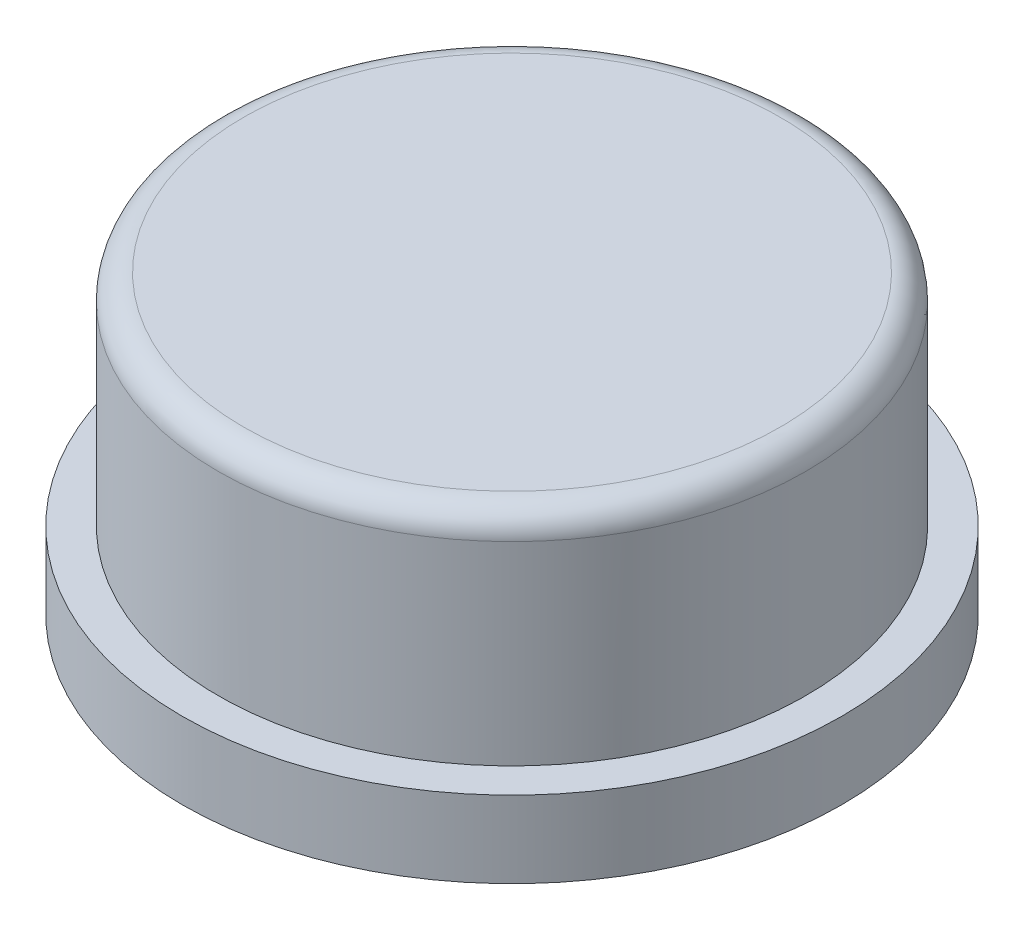
ISO-10303-21;
HEADER;
FILE_DESCRIPTION(('STEP AP214'),'2;1');
FILE_NAME('part.step','',(''),(''),'','','');
FILE_SCHEMA(('AUTOMOTIVE_DESIGN { 1 0 10303 214 1 1 1 1 }'));
ENDSEC;
DATA;
#1=APPLICATION_CONTEXT('core data for automotive mechanical design processes');
#2=APPLICATION_PROTOCOL_DEFINITION('international standard','automotive_design',2000,#1);
#3=PRODUCT_CONTEXT('',#1,'mechanical');
#4=PRODUCT('Part','Part','',(#3));
#5=PRODUCT_RELATED_PRODUCT_CATEGORY('part','',(#4));
#6=PRODUCT_DEFINITION_FORMATION('','',#4);
#7=PRODUCT_DEFINITION_CONTEXT('part definition',#1,'design');
#8=PRODUCT_DEFINITION('design','',#6,#7);
#9=PRODUCT_DEFINITION_SHAPE('','',#8);
#10=(LENGTH_UNIT() NAMED_UNIT(*) SI_UNIT(.MILLI.,.METRE.));
#11=(NAMED_UNIT(*) PLANE_ANGLE_UNIT() SI_UNIT($,.RADIAN.));
#12=(NAMED_UNIT(*) SI_UNIT($,.STERADIAN.) SOLID_ANGLE_UNIT());
#13=UNCERTAINTY_MEASURE_WITH_UNIT(LENGTH_MEASURE(1.E-05),#10,'distance_accuracy_value','');
#14=(GEOMETRIC_REPRESENTATION_CONTEXT(3) GLOBAL_UNCERTAINTY_ASSIGNED_CONTEXT((#13)) GLOBAL_UNIT_ASSIGNED_CONTEXT((#10,
#11,#12)) REPRESENTATION_CONTEXT('',''));
#15=CARTESIAN_POINT('',(0.,0.,0.));
#16=DIRECTION('',(0.,0.,1.));
#17=DIRECTION('',(1.,0.,0.));
#18=AXIS2_PLACEMENT_3D('',#15,#16,#17);
#19=CARTESIAN_POINT('',(0.,1.5,0.));
#20=DIRECTION('',(0.,1.,0.));
#21=DIRECTION('',(0.,0.,1.));
#22=AXIS2_PLACEMENT_3D('',#19,#20,#21);
#23=PLANE('',#22);
#24=CARTESIAN_POINT('',(0.,1.5,0.));
#25=DIRECTION('',(0.,1.,0.));
#26=DIRECTION('',(0.,0.,1.));
#27=AXIS2_PLACEMENT_3D('',#24,#25,#26);
#28=CIRCLE('',#27,6.45);
#29=CARTESIAN_POINT('',(0.,1.5,6.45));
#30=VERTEX_POINT('',#29);
#31=EDGE_CURVE('E42',#30,#30,#28,.T.);
#32=ORIENTED_EDGE('',*,*,#31,.T.);
#33=EDGE_LOOP('',(#32));
#34=FACE_BOUND('',#33,.T.);
#35=CARTESIAN_POINT('',(0.,1.5,0.));
#36=DIRECTION('',(0.,1.,0.));
#37=DIRECTION('',(0.,0.,1.));
#38=AXIS2_PLACEMENT_3D('',#35,#36,#37);
#39=CIRCLE('',#38,5.75);
#40=CARTESIAN_POINT('',(0.,1.5,-5.75));
#41=VERTEX_POINT('',#40);
#42=EDGE_CURVE('E50',#41,#41,#39,.T.);
#43=ORIENTED_EDGE('',*,*,#42,.F.);
#44=EDGE_LOOP('',(#43));
#45=FACE_BOUND('',#44,.T.);
#46=ADVANCED_FACE('F31',(#34,#45),#23,.T.);
#47=CARTESIAN_POINT('',(0.,1.5,0.));
#48=DIRECTION('',(0.,-1.,0.));
#49=DIRECTION('',(0.,0.,-1.));
#50=AXIS2_PLACEMENT_3D('',#47,#48,#49);
#51=CYLINDRICAL_SURFACE('',#50,6.45);
#52=ORIENTED_EDGE('',*,*,#31,.F.);
#53=EDGE_LOOP('',(#52));
#54=FACE_BOUND('',#53,.T.);
#55=CARTESIAN_POINT('',(0.,0.,0.));
#56=DIRECTION('',(0.,1.,0.));
#57=DIRECTION('',(0.,0.,1.));
#58=AXIS2_PLACEMENT_3D('',#55,#56,#57);
#59=CIRCLE('',#58,6.45);
#60=CARTESIAN_POINT('',(0.,0.,6.45));
#61=VERTEX_POINT('',#60);
#62=EDGE_CURVE('E46',#61,#61,#59,.T.);
#63=ORIENTED_EDGE('',*,*,#62,.T.);
#64=EDGE_LOOP('',(#63));
#65=FACE_BOUND('',#64,.T.);
#66=ADVANCED_FACE('F58',(#54,#65),#51,.T.);
#67=CARTESIAN_POINT('',(0.,0.,0.));
#68=DIRECTION('',(0.,1.,0.));
#69=DIRECTION('',(0.,0.,1.));
#70=AXIS2_PLACEMENT_3D('',#67,#68,#69);
#71=PLANE('',#70);
#72=ORIENTED_EDGE('',*,*,#62,.F.);
#73=EDGE_LOOP('',(#72));
#74=FACE_BOUND('',#73,.T.);
#75=ADVANCED_FACE('F64',(#74),#71,.F.);
#76=CARTESIAN_POINT('',(0.,5.8,0.));
#77=DIRECTION('',(0.,-1.,0.));
#78=DIRECTION('',(0.,0.,-1.));
#79=AXIS2_PLACEMENT_3D('',#76,#77,#78);
#80=CYLINDRICAL_SURFACE('',#79,5.75);
#81=CARTESIAN_POINT('',(0.,5.3,0.));
#82=DIRECTION('',(0.,1.,0.));
#83=DIRECTION('',(0.,0.,1.));
#84=AXIS2_PLACEMENT_3D('',#81,#82,#83);
#85=CIRCLE('',#84,5.75);
#86=CARTESIAN_POINT('',(0.,5.3,-5.75));
#87=VERTEX_POINT('',#86);
#88=EDGE_CURVE('E10',#87,#87,#85,.F.);
#89=CARTESIAN_POINT('',(0.,5.3,-5.75));
#90=CARTESIAN_POINT('',(0.,5.26041666666667,-5.75));
#91=CARTESIAN_POINT('',(0.,5.22083333333333,-5.75));
#92=CARTESIAN_POINT('',(0.,5.14166666666666,-5.75));
#93=CARTESIAN_POINT('',(0.,5.10208333333333,-5.75));
#94=CARTESIAN_POINT('',(0.,5.02291666666667,-5.75));
#95=CARTESIAN_POINT('',(0.,4.98333333333333,-5.75));
#96=CARTESIAN_POINT('',(0.,4.90416666666667,-5.75));
#97=CARTESIAN_POINT('',(0.,4.86458333333333,-5.75));
#98=CARTESIAN_POINT('',(0.,4.78541666666667,-5.75));
#99=CARTESIAN_POINT('',(0.,4.74583333333333,-5.75));
#100=CARTESIAN_POINT('',(0.,4.66666666666667,-5.75));
#101=CARTESIAN_POINT('',(0.,4.62708333333333,-5.75));
#102=CARTESIAN_POINT('',(0.,4.54791666666667,-5.75));
#103=CARTESIAN_POINT('',(0.,4.50833333333333,-5.75));
#104=CARTESIAN_POINT('',(0.,4.42916666666667,-5.75));
#105=CARTESIAN_POINT('',(0.,4.38958333333333,-5.75));
#106=CARTESIAN_POINT('',(0.,4.31041666666667,-5.75));
#107=CARTESIAN_POINT('',(0.,4.27083333333333,-5.75));
#108=CARTESIAN_POINT('',(0.,4.19166666666667,-5.75));
#109=CARTESIAN_POINT('',(0.,4.15208333333333,-5.75));
#110=CARTESIAN_POINT('',(0.,4.07291666666667,-5.75));
#111=CARTESIAN_POINT('',(0.,4.03333333333333,-5.75));
#112=CARTESIAN_POINT('',(0.,3.95416666666667,-5.75));
#113=CARTESIAN_POINT('',(0.,3.91458333333333,-5.75));
#114=CARTESIAN_POINT('',(0.,3.83541666666667,-5.75));
#115=CARTESIAN_POINT('',(0.,3.79583333333333,-5.75));
#116=CARTESIAN_POINT('',(0.,3.71666666666667,-5.75));
#117=CARTESIAN_POINT('',(0.,3.67708333333333,-5.75));
#118=CARTESIAN_POINT('',(0.,3.59791666666667,-5.75));
#119=CARTESIAN_POINT('',(0.,3.55833333333333,-5.75));
#120=CARTESIAN_POINT('',(0.,3.47916666666667,-5.75));
#121=CARTESIAN_POINT('',(0.,3.43958333333333,-5.75));
#122=CARTESIAN_POINT('',(0.,3.36041666666667,-5.75));
#123=CARTESIAN_POINT('',(0.,3.32083333333333,-5.75));
#124=CARTESIAN_POINT('',(0.,3.24166666666667,-5.75));
#125=CARTESIAN_POINT('',(0.,3.20208333333333,-5.75));
#126=CARTESIAN_POINT('',(0.,3.12291666666667,-5.75));
#127=CARTESIAN_POINT('',(0.,3.08333333333333,-5.75));
#128=CARTESIAN_POINT('',(0.,3.00416666666667,-5.75));
#129=CARTESIAN_POINT('',(0.,2.96458333333333,-5.75));
#130=CARTESIAN_POINT('',(0.,2.88541666666667,-5.75));
#131=CARTESIAN_POINT('',(0.,2.84583333333333,-5.75));
#132=CARTESIAN_POINT('',(0.,2.76666666666667,-5.75));
#133=CARTESIAN_POINT('',(0.,2.72708333333333,-5.75));
#134=CARTESIAN_POINT('',(0.,2.64791666666667,-5.75));
#135=CARTESIAN_POINT('',(0.,2.60833333333333,-5.75));
#136=CARTESIAN_POINT('',(0.,2.52916666666667,-5.75));
#137=CARTESIAN_POINT('',(0.,2.48958333333333,-5.75));
#138=CARTESIAN_POINT('',(0.,2.41041666666667,-5.75));
#139=CARTESIAN_POINT('',(0.,2.37083333333333,-5.75));
#140=CARTESIAN_POINT('',(0.,2.29166666666667,-5.75));
#141=CARTESIAN_POINT('',(0.,2.25208333333333,-5.75));
#142=CARTESIAN_POINT('',(0.,2.17291666666667,-5.75));
#143=CARTESIAN_POINT('',(0.,2.13333333333333,-5.75));
#144=CARTESIAN_POINT('',(0.,2.05416666666667,-5.75));
#145=CARTESIAN_POINT('',(0.,2.01458333333333,-5.75));
#146=CARTESIAN_POINT('',(0.,1.93541666666667,-5.75));
#147=CARTESIAN_POINT('',(0.,1.89583333333333,-5.75));
#148=CARTESIAN_POINT('',(0.,1.81666666666667,-5.75));
#149=CARTESIAN_POINT('',(0.,1.77708333333333,-5.75));
#150=CARTESIAN_POINT('',(0.,1.69791666666667,-5.75));
#151=CARTESIAN_POINT('',(0.,1.65833333333333,-5.75));
#152=CARTESIAN_POINT('',(0.,1.57916666666667,-5.75));
#153=CARTESIAN_POINT('',(0.,1.53958333333333,-5.75));
#154=CARTESIAN_POINT('',(0.,1.5,-5.75));
#155=B_SPLINE_CURVE_WITH_KNOTS('',3,(#89,#90,#91,#92,#93,#94,#95,#96,#97,#98,#99,#100,#101,#102,
#103,#104,#105,#106,#107,#108,#109,#110,#111,#112,#113,#114,#115,#116,#117,#118,#119,#120,#121,
#122,#123,#124,#125,#126,#127,#128,#129,#130,#131,#132,#133,#134,#135,#136,#137,#138,#139,#140,
#141,#142,#143,#144,#145,#146,#147,#148,#149,#150,#151,#152,#153,#154),.UNSPECIFIED.,.F.,.F.,(4,
2,2,2,2,2,2,2,2,2,2,2,2,2,2,2,2,2,2,2,2,2,2,2,2,2,2,2,2,2,2,2,4),(0.,0.11875,0.2375,0.35625,
0.475,0.59375,0.7125,0.831249999999999,0.95,1.06875,1.1875,1.30625,1.425,1.54375,1.6625,1.78125,
1.9,2.01875,2.1375,2.25625,2.375,2.49375,2.6125,2.73125,2.85,2.96875,3.0875,3.20625,3.325,
3.44375,3.5625,3.68125,3.8),.UNSPECIFIED.);
#156=EDGE_CURVE('BSEAM55',#87,#41,#155,.T.);
#157=ORIENTED_EDGE('',*,*,#88,.T.);
#158=ORIENTED_EDGE('',*,*,#42,.T.);
#159=ORIENTED_EDGE('',*,*,#156,.T.);
#160=ORIENTED_EDGE('',*,*,#156,.F.);
#161=EDGE_LOOP('',(#157,#159,#158,#160));
#162=FACE_BOUND('',#161,.T.);
#163=ADVANCED_FACE('F55',(#162),#80,.T.);
#164=CARTESIAN_POINT('',(0.,5.8,0.));
#165=DIRECTION('',(0.,1.,0.));
#166=DIRECTION('',(0.,0.,1.));
#167=AXIS2_PLACEMENT_3D('',#164,#165,#166);
#168=PLANE('',#167);
#169=CARTESIAN_POINT('',(0.,5.8,0.));
#170=DIRECTION('',(0.,1.,0.));
#171=DIRECTION('',(0.,0.,1.));
#172=AXIS2_PLACEMENT_3D('',#169,#170,#171);
#173=CIRCLE('',#172,5.25);
#174=CARTESIAN_POINT('',(0.,5.8,5.25));
#175=VERTEX_POINT('',#174);
#176=EDGE_CURVE('E38',#175,#175,#173,.T.);
#177=ORIENTED_EDGE('',*,*,#176,.T.);
#178=EDGE_LOOP('',(#177));
#179=FACE_BOUND('',#178,.T.);
#180=ADVANCED_FACE('F74',(#179),#168,.T.);
#181=CARTESIAN_POINT('',(0.,5.3,0.));
#182=DIRECTION('',(0.,1.,0.));
#183=DIRECTION('',(0.,0.,1.));
#184=AXIS2_PLACEMENT_3D('',#181,#182,#183);
#185=TOROIDAL_SURFACE('',#184,5.25,0.5);
#186=ORIENTED_EDGE('',*,*,#88,.F.);
#187=EDGE_LOOP('',(#186));
#188=FACE_BOUND('',#187,.T.);
#189=ORIENTED_EDGE('',*,*,#176,.F.);
#190=EDGE_LOOP('',(#189));
#191=FACE_BOUND('',#190,.T.);
#192=ADVANCED_FACE('F33',(#188,#191),#185,.T.);
#193=CLOSED_SHELL('',(#46,#66,#75,#163,#180,#192));
#194=MANIFOLD_SOLID_BREP('B2',#193);
#195=ADVANCED_BREP_SHAPE_REPRESENTATION('',(#18,#194),#14);
#196=SHAPE_DEFINITION_REPRESENTATION(#9,#195);
ENDSEC;
END-ISO-10303-21;
